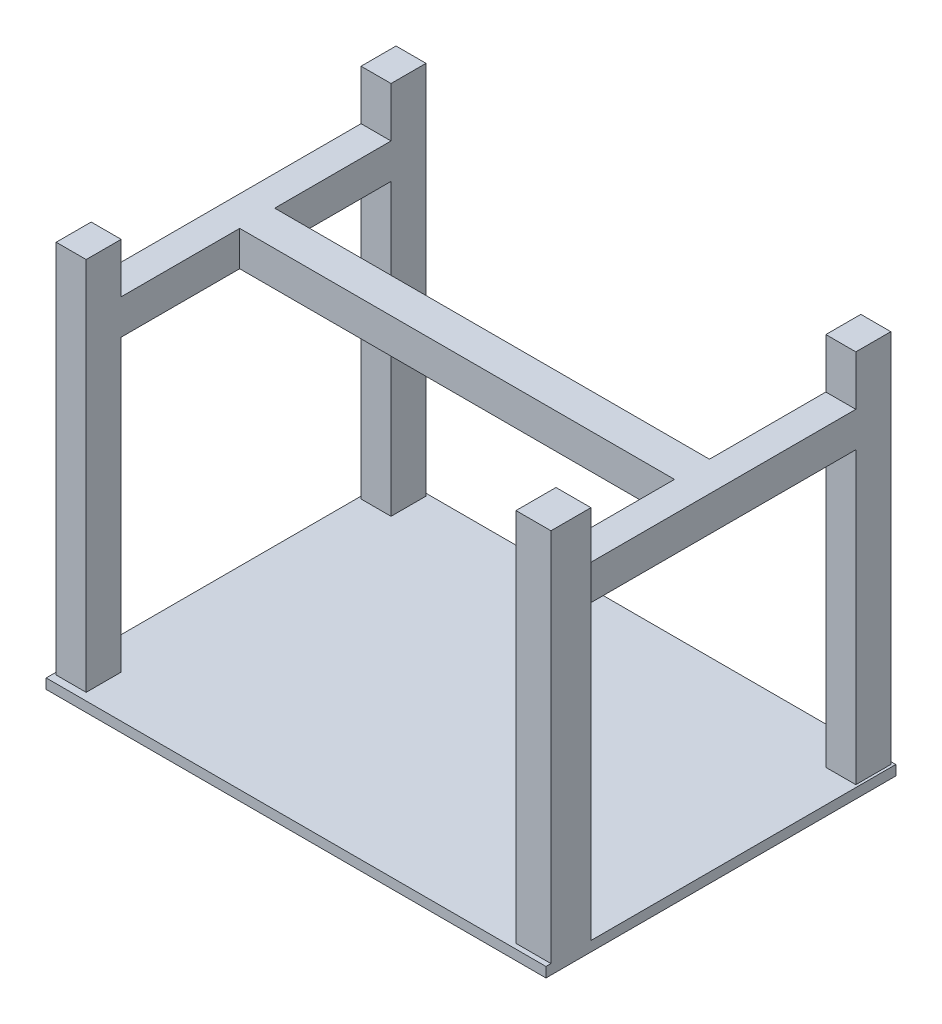
ISO-10303-21;
HEADER;
FILE_DESCRIPTION(('STEP AP214'),'2;1');
FILE_NAME('part.step','',(''),(''),'','','');
FILE_SCHEMA(('AUTOMOTIVE_DESIGN { 1 0 10303 214 1 1 1 1 }'));
ENDSEC;
DATA;
#1=APPLICATION_CONTEXT('core data for automotive mechanical design processes');
#2=APPLICATION_PROTOCOL_DEFINITION('international standard','automotive_design',2000,#1);
#3=PRODUCT_CONTEXT('',#1,'mechanical');
#4=PRODUCT('Part','Part','',(#3));
#5=PRODUCT_RELATED_PRODUCT_CATEGORY('part','',(#4));
#6=PRODUCT_DEFINITION_FORMATION('','',#4);
#7=PRODUCT_DEFINITION_CONTEXT('part definition',#1,'design');
#8=PRODUCT_DEFINITION('design','',#6,#7);
#9=PRODUCT_DEFINITION_SHAPE('','',#8);
#10=(LENGTH_UNIT() NAMED_UNIT(*) SI_UNIT(.MILLI.,.METRE.));
#11=(NAMED_UNIT(*) PLANE_ANGLE_UNIT() SI_UNIT($,.RADIAN.));
#12=(NAMED_UNIT(*) SI_UNIT($,.STERADIAN.) SOLID_ANGLE_UNIT());
#13=UNCERTAINTY_MEASURE_WITH_UNIT(LENGTH_MEASURE(1.E-05),#10,'distance_accuracy_value','');
#14=(GEOMETRIC_REPRESENTATION_CONTEXT(3) GLOBAL_UNCERTAINTY_ASSIGNED_CONTEXT((#13)) GLOBAL_UNIT_ASSIGNED_CONTEXT((#10,
#11,#12)) REPRESENTATION_CONTEXT('',''));
#15=CARTESIAN_POINT('',(0.,0.,0.));
#16=DIRECTION('',(0.,0.,1.));
#17=DIRECTION('',(1.,0.,0.));
#18=AXIS2_PLACEMENT_3D('',#15,#16,#17);
#19=CARTESIAN_POINT('',(869.999999999995,1540.,-690.000000000006));
#20=DIRECTION('',(1.,0.,0.));
#21=DIRECTION('',(0.,0.,-1.));
#22=AXIS2_PLACEMENT_3D('',#19,#20,#21);
#23=PLANE('',#22);
#24=DIRECTION('',(0.,1.,0.));
#25=VECTOR('',#24,1.);
#26=CARTESIAN_POINT('',(870.,1340.83173517957,55.6517130941631));
#27=LINE('',#26,#25);
#28=CARTESIAN_POINT('',(870.,1200.83173517957,55.6517130941631));
#29=VERTEX_POINT('',#28);
#30=CARTESIAN_POINT('',(869.99999999999,1340.83173517957,55.6517130941628));
#31=VERTEX_POINT('',#30);
#32=EDGE_CURVE('E296',#29,#31,#27,.T.);
#33=ORIENTED_EDGE('',*,*,#32,.F.);
#34=DIRECTION('',(0.,0.,1.));
#35=VECTOR('',#34,1.);
#36=CARTESIAN_POINT('',(869.999999999991,1200.83173517957,-734.390889145865));
#37=LINE('',#36,#35);
#38=CARTESIAN_POINT('',(869.999999999991,1200.83173517957,519.999999999994));
#39=VERTEX_POINT('',#38);
#40=EDGE_CURVE('E282',#29,#39,#37,.T.);
#41=ORIENTED_EDGE('',*,*,#40,.T.);
#42=DIRECTION('',(0.,-1.,0.));
#43=VECTOR('',#42,1.);
#44=CARTESIAN_POINT('',(869.999999999989,1540.,519.999999999994));
#45=LINE('',#44,#43);
#46=CARTESIAN_POINT('',(869.99999999999,1340.83173517957,519.999999999993));
#47=VERTEX_POINT('',#46);
#48=EDGE_CURVE('E514',#47,#39,#45,.T.);
#49=ORIENTED_EDGE('',*,*,#48,.F.);
#50=DIRECTION('',(0.,0.,1.));
#51=VECTOR('',#50,1.);
#52=CARTESIAN_POINT('',(869.99999999999,1340.83173517957,-734.390889145865));
#53=LINE('',#52,#51);
#54=EDGE_CURVE('E86',#31,#47,#53,.T.);
#55=ORIENTED_EDGE('',*,*,#54,.F.);
#56=EDGE_LOOP('',(#33,#41,#49,#55));
#57=FACE_BOUND('',#56,.T.);
#58=ADVANCED_FACE('F71',(#57),#23,.F.);
#59=DIRECTION('',(0.,-1.,0.));
#60=VECTOR('',#59,1.);
#61=CARTESIAN_POINT('',(869.999999999999,1340.83173517957,-84.3482869058369));
#62=LINE('',#61,#60);
#63=CARTESIAN_POINT('',(869.99999999999,1340.83173517957,-84.3482869058372));
#64=VERTEX_POINT('',#63);
#65=CARTESIAN_POINT('',(869.999999999991,1200.83173517957,-84.3482869058372));
#66=VERTEX_POINT('',#65);
#67=EDGE_CURVE('E94',#64,#66,#62,.T.);
#68=ORIENTED_EDGE('',*,*,#67,.F.);
#69=CARTESIAN_POINT('',(869.99999999999,1340.83173517957,-550.000000000006));
#70=VERTEX_POINT('',#69);
#71=EDGE_CURVE('E328',#70,#64,#53,.T.);
#72=ORIENTED_EDGE('',*,*,#71,.F.);
#73=DIRECTION('',(0.,-1.,0.));
#74=VECTOR('',#73,1.);
#75=CARTESIAN_POINT('',(869.999999999996,1540.,-550.000000000006));
#76=LINE('',#75,#74);
#77=CARTESIAN_POINT('',(869.999999999996,1540.,-550.000000000006));
#78=VERTEX_POINT('',#77);
#79=EDGE_CURVE('E355',#78,#70,#76,.T.);
#80=ORIENTED_EDGE('',*,*,#79,.F.);
#81=DIRECTION('',(0.,0.,1.));
#82=VECTOR('',#81,1.);
#83=CARTESIAN_POINT('',(869.999999999995,1540.,-690.000000000006));
#84=LINE('',#83,#82);
#85=CARTESIAN_POINT('',(869.999999999995,1540.,-690.000000000006));
#86=VERTEX_POINT('',#85);
#87=EDGE_CURVE('E385',#86,#78,#84,.T.);
#88=ORIENTED_EDGE('',*,*,#87,.F.);
#89=DIRECTION('',(0.,-1.,0.));
#90=VECTOR('',#89,1.);
#91=CARTESIAN_POINT('',(869.999999999995,1540.,-690.000000000006));
#92=LINE('',#91,#90);
#93=CARTESIAN_POINT('',(869.999999999995,40.,-690.000000000006));
#94=VERTEX_POINT('',#93);
#95=EDGE_CURVE('E350',#86,#94,#92,.T.);
#96=ORIENTED_EDGE('',*,*,#95,.T.);
#97=DIRECTION('',(0.,0.,1.));
#98=VECTOR('',#97,1.);
#99=CARTESIAN_POINT('',(869.999999999995,40.,-690.000000000006));
#100=LINE('',#99,#98);
#101=CARTESIAN_POINT('',(869.999999999996,40.,-550.000000000006));
#102=VERTEX_POINT('',#101);
#103=EDGE_CURVE('E373',#94,#102,#100,.T.);
#104=ORIENTED_EDGE('',*,*,#103,.T.);
#105=CARTESIAN_POINT('',(869.999999999991,1200.83173517957,-550.000000000006));
#106=VERTEX_POINT('',#105);
#107=EDGE_CURVE('E353',#106,#102,#76,.T.);
#108=ORIENTED_EDGE('',*,*,#107,.F.);
#109=EDGE_CURVE('E292',#106,#66,#37,.T.);
#110=ORIENTED_EDGE('',*,*,#109,.T.);
#111=EDGE_LOOP('',(#68,#72,#80,#88,#96,#104,#108,#110));
#112=FACE_BOUND('',#111,.T.);
#113=ADVANCED_FACE('F547',(#112),#23,.F.);
#114=CARTESIAN_POINT('',(-870.,1540.,-690.));
#115=DIRECTION('',(1.,0.,0.));
#116=DIRECTION('',(0.,0.,-1.));
#117=AXIS2_PLACEMENT_3D('',#114,#115,#116);
#118=PLANE('',#117);
#119=DIRECTION('',(0.,0.,1.));
#120=VECTOR('',#119,1.);
#121=CARTESIAN_POINT('',(-870.,1200.83173517957,-734.390889145865));
#122=LINE('',#121,#120);
#123=CARTESIAN_POINT('',(-870.,1200.83173517957,55.6517130941752));
#124=VERTEX_POINT('',#123);
#125=CARTESIAN_POINT('',(-870.,1200.83173517957,530.));
#126=VERTEX_POINT('',#125);
#127=EDGE_CURVE('E324',#124,#126,#122,.T.);
#128=ORIENTED_EDGE('',*,*,#127,.F.);
#129=DIRECTION('',(0.,-1.,0.));
#130=VECTOR('',#129,1.);
#131=CARTESIAN_POINT('',(-870.,1340.83173517957,55.6517130941741));
#132=LINE('',#131,#130);
#133=CARTESIAN_POINT('',(-870.,1340.83173517957,55.6517130941741));
#134=VERTEX_POINT('',#133);
#135=EDGE_CURVE('E302',#134,#124,#132,.T.);
#136=ORIENTED_EDGE('',*,*,#135,.F.);
#137=DIRECTION('',(0.,0.,1.));
#138=VECTOR('',#137,1.);
#139=CARTESIAN_POINT('',(-870.,1340.83173517957,-734.390889145865));
#140=LINE('',#139,#138);
#141=CARTESIAN_POINT('',(-870.,1340.83173517957,530.));
#142=VERTEX_POINT('',#141);
#143=EDGE_CURVE('E321',#134,#142,#140,.T.);
#144=ORIENTED_EDGE('',*,*,#143,.T.);
#145=DIRECTION('',(0.,-1.,0.));
#146=VECTOR('',#145,1.);
#147=CARTESIAN_POINT('',(-870.,1540.,530.));
#148=LINE('',#147,#146);
#149=CARTESIAN_POINT('',(-870.,1540.,530.));
#150=VERTEX_POINT('',#149);
#151=EDGE_CURVE('E477',#150,#142,#148,.T.);
#152=ORIENTED_EDGE('',*,*,#151,.F.);
#153=DIRECTION('',(0.,0.,-1.));
#154=VECTOR('',#153,1.);
#155=CARTESIAN_POINT('',(-870.,1540.,0.));
#156=LINE('',#155,#154);
#157=CARTESIAN_POINT('',(-870.,1540.,670.));
#158=VERTEX_POINT('',#157);
#159=EDGE_CURVE('E457',#158,#150,#156,.T.);
#160=ORIENTED_EDGE('',*,*,#159,.F.);
#161=DIRECTION('',(0.,-1.,0.));
#162=VECTOR('',#161,1.);
#163=CARTESIAN_POINT('',(-870.,1540.,670.));
#164=LINE('',#163,#162);
#165=CARTESIAN_POINT('',(-870.,40.,670.));
#166=VERTEX_POINT('',#165);
#167=EDGE_CURVE('E480',#158,#166,#164,.T.);
#168=ORIENTED_EDGE('',*,*,#167,.T.);
#169=DIRECTION('',(0.,0.,-1.));
#170=VECTOR('',#169,1.);
#171=CARTESIAN_POINT('',(-870.,40.,0.));
#172=LINE('',#171,#170);
#173=CARTESIAN_POINT('',(-870.,40.,530.));
#174=VERTEX_POINT('',#173);
#175=EDGE_CURVE('E468',#166,#174,#172,.T.);
#176=ORIENTED_EDGE('',*,*,#175,.T.);
#177=EDGE_CURVE('E476',#126,#174,#148,.T.);
#178=ORIENTED_EDGE('',*,*,#177,.F.);
#179=EDGE_LOOP('',(#128,#136,#144,#152,#160,#168,#176,#178));
#180=FACE_BOUND('',#179,.T.);
#181=ADVANCED_FACE('F574',(#180),#118,.T.);
#182=CARTESIAN_POINT('',(-870.,1340.83173517957,-549.999999999993));
#183=VERTEX_POINT('',#182);
#184=CARTESIAN_POINT('',(-870.,1340.83173517957,-84.3482869058369));
#185=VERTEX_POINT('',#184);
#186=EDGE_CURVE('E318',#183,#185,#140,.T.);
#187=ORIENTED_EDGE('',*,*,#186,.T.);
#188=DIRECTION('',(0.,1.,0.));
#189=VECTOR('',#188,1.);
#190=CARTESIAN_POINT('',(-870.,1340.83173517957,-84.3482869058259));
#191=LINE('',#190,#189);
#192=CARTESIAN_POINT('',(-870.,1200.83173517957,-84.3482869058369));
#193=VERTEX_POINT('',#192);
#194=EDGE_CURVE('E341',#193,#185,#191,.T.);
#195=ORIENTED_EDGE('',*,*,#194,.F.);
#196=CARTESIAN_POINT('',(-870.,1200.83173517957,-550.));
#197=VERTEX_POINT('',#196);
#198=EDGE_CURVE('E322',#197,#193,#122,.T.);
#199=ORIENTED_EDGE('',*,*,#198,.F.);
#200=DIRECTION('',(0.,-1.,0.));
#201=VECTOR('',#200,1.);
#202=CARTESIAN_POINT('',(-870.,1540.,-550.));
#203=LINE('',#202,#201);
#204=CARTESIAN_POINT('',(-870.,40.,-550.));
#205=VERTEX_POINT('',#204);
#206=EDGE_CURVE('E425',#197,#205,#203,.T.);
#207=ORIENTED_EDGE('',*,*,#206,.T.);
#208=DIRECTION('',(0.,0.,1.));
#209=VECTOR('',#208,1.);
#210=CARTESIAN_POINT('',(-870.,40.,-690.));
#211=LINE('',#210,#209);
#212=CARTESIAN_POINT('',(-870.,40.,-690.));
#213=VERTEX_POINT('',#212);
#214=EDGE_CURVE('E439',#213,#205,#211,.T.);
#215=ORIENTED_EDGE('',*,*,#214,.F.);
#216=DIRECTION('',(0.,-1.,0.));
#217=VECTOR('',#216,1.);
#218=CARTESIAN_POINT('',(-870.,1540.,-690.));
#219=LINE('',#218,#217);
#220=CARTESIAN_POINT('',(-870.,1540.,-690.));
#221=VERTEX_POINT('',#220);
#222=EDGE_CURVE('E418',#221,#213,#219,.T.);
#223=ORIENTED_EDGE('',*,*,#222,.F.);
#224=DIRECTION('',(0.,0.,1.));
#225=VECTOR('',#224,1.);
#226=CARTESIAN_POINT('',(-870.,1540.,-690.));
#227=LINE('',#226,#225);
#228=CARTESIAN_POINT('',(-870.,1540.,-550.));
#229=VERTEX_POINT('',#228);
#230=EDGE_CURVE('E446',#221,#229,#227,.T.);
#231=ORIENTED_EDGE('',*,*,#230,.T.);
#232=EDGE_CURVE('E422',#229,#183,#203,.T.);
#233=ORIENTED_EDGE('',*,*,#232,.T.);
#234=EDGE_LOOP('',(#187,#195,#199,#207,#215,#223,#231,#233));
#235=FACE_BOUND('',#234,.T.);
#236=ADVANCED_FACE('F556',(#235),#118,.T.);
#237=CARTESIAN_POINT('',(0.,1540.,530.));
#238=DIRECTION('',(0.,0.,-1.));
#239=DIRECTION('',(-1.,0.,0.));
#240=AXIS2_PLACEMENT_3D('',#237,#238,#239);
#241=PLANE('',#240);
#242=DIRECTION('',(1.,0.,0.));
#243=VECTOR('',#242,1.);
#244=CARTESIAN_POINT('',(0.,1340.83173517957,530.));
#245=LINE('',#244,#243);
#246=CARTESIAN_POINT('',(-990.,1340.83173517957,530.));
#247=VERTEX_POINT('',#246);
#248=EDGE_CURVE('E346',#247,#142,#245,.T.);
#249=ORIENTED_EDGE('',*,*,#248,.F.);
#250=DIRECTION('',(0.,-1.,0.));
#251=VECTOR('',#250,1.);
#252=CARTESIAN_POINT('',(-990.,1540.,530.));
#253=LINE('',#252,#251);
#254=CARTESIAN_POINT('',(-990.,1540.,530.));
#255=VERTEX_POINT('',#254);
#256=EDGE_CURVE('E473',#255,#247,#253,.T.);
#257=ORIENTED_EDGE('',*,*,#256,.F.);
#258=DIRECTION('',(1.,0.,0.));
#259=VECTOR('',#258,1.);
#260=CARTESIAN_POINT('',(0.,1540.,530.));
#261=LINE('',#260,#259);
#262=EDGE_CURVE('E459',#255,#150,#261,.T.);
#263=ORIENTED_EDGE('',*,*,#262,.T.);
#264=ORIENTED_EDGE('',*,*,#151,.T.);
#265=EDGE_LOOP('',(#249,#257,#263,#264));
#266=FACE_BOUND('',#265,.T.);
#267=ADVANCED_FACE('F570',(#266),#241,.T.);
#268=CARTESIAN_POINT('',(989.999999999996,1540.,-550.000000000007));
#269=DIRECTION('',(0.,0.,1.));
#270=DIRECTION('',(1.,0.,0.));
#271=AXIS2_PLACEMENT_3D('',#268,#269,#270);
#272=PLANE('',#271);
#273=DIRECTION('',(1.,0.,0.));
#274=VECTOR('',#273,1.);
#275=CARTESIAN_POINT('',(989.999999999992,1340.83173517957,-550.000000000007));
#276=LINE('',#275,#274);
#277=CARTESIAN_POINT('',(989.99999999999,1340.83173517957,-550.000000000007));
#278=VERTEX_POINT('',#277);
#279=EDGE_CURVE('E338',#70,#278,#276,.T.);
#280=ORIENTED_EDGE('',*,*,#279,.T.);
#281=DIRECTION('',(0.,-1.,0.));
#282=VECTOR('',#281,1.);
#283=CARTESIAN_POINT('',(989.999999999996,1540.,-550.000000000007));
#284=LINE('',#283,#282);
#285=CARTESIAN_POINT('',(989.999999999996,1540.,-550.000000000007));
#286=VERTEX_POINT('',#285);
#287=EDGE_CURVE('E359',#286,#278,#284,.T.);
#288=ORIENTED_EDGE('',*,*,#287,.F.);
#289=DIRECTION('',(-1.,0.,0.));
#290=VECTOR('',#289,1.);
#291=CARTESIAN_POINT('',(989.999999999996,1540.,-550.000000000007));
#292=LINE('',#291,#290);
#293=EDGE_CURVE('E382',#286,#78,#292,.T.);
#294=ORIENTED_EDGE('',*,*,#293,.T.);
#295=ORIENTED_EDGE('',*,*,#79,.T.);
#296=EDGE_LOOP('',(#280,#288,#294,#295));
#297=FACE_BOUND('',#296,.T.);
#298=ADVANCED_FACE('F542',(#297),#272,.T.);
#299=CARTESIAN_POINT('',(-990.,1540.,-550.));
#300=DIRECTION('',(0.,0.,-1.));
#301=DIRECTION('',(-1.,0.,0.));
#302=AXIS2_PLACEMENT_3D('',#299,#300,#301);
#303=PLANE('',#302);
#304=DIRECTION('',(0.,-1.,0.));
#305=VECTOR('',#304,1.);
#306=CARTESIAN_POINT('',(-990.,1540.,-550.));
#307=LINE('',#306,#305);
#308=CARTESIAN_POINT('',(-990.,1540.,-550.));
#309=VERTEX_POINT('',#308);
#310=CARTESIAN_POINT('',(-990.,1340.83173517957,-549.999999999992));
#311=VERTEX_POINT('',#310);
#312=EDGE_CURVE('E426',#309,#311,#307,.T.);
#313=ORIENTED_EDGE('',*,*,#312,.T.);
#314=DIRECTION('',(1.,0.,0.));
#315=VECTOR('',#314,1.);
#316=CARTESIAN_POINT('',(-989.999999999998,1340.83173517957,-549.999999999992));
#317=LINE('',#316,#315);
#318=EDGE_CURVE('E311',#311,#183,#317,.T.);
#319=ORIENTED_EDGE('',*,*,#318,.T.);
#320=ORIENTED_EDGE('',*,*,#232,.F.);
#321=DIRECTION('',(1.,0.,0.));
#322=VECTOR('',#321,1.);
#323=CARTESIAN_POINT('',(-990.,1540.,-550.));
#324=LINE('',#323,#322);
#325=EDGE_CURVE('E444',#309,#229,#324,.T.);
#326=ORIENTED_EDGE('',*,*,#325,.F.);
#327=EDGE_LOOP('',(#313,#319,#320,#326));
#328=FACE_BOUND('',#327,.T.);
#329=ADVANCED_FACE('F561',(#328),#303,.F.);
#330=CARTESIAN_POINT('',(0.,40.,0.));
#331=DIRECTION('',(0.,1.,0.));
#332=DIRECTION('',(0.,0.,1.));
#333=AXIS2_PLACEMENT_3D('',#330,#331,#332);
#334=PLANE('',#333);
#335=DIRECTION('',(1.,0.,0.));
#336=VECTOR('',#335,1.);
#337=CARTESIAN_POINT('',(-990.,40.,-690.));
#338=LINE('',#337,#336);
#339=CARTESIAN_POINT('',(-990.,40.,-690.));
#340=VERTEX_POINT('',#339);
#341=EDGE_CURVE('E402',#340,#213,#338,.T.);
#342=ORIENTED_EDGE('',*,*,#341,.T.);
#343=ORIENTED_EDGE('',*,*,#214,.T.);
#344=DIRECTION('',(1.,0.,0.));
#345=VECTOR('',#344,1.);
#346=CARTESIAN_POINT('',(-990.,40.,-550.));
#347=LINE('',#346,#345);
#348=CARTESIAN_POINT('',(-990.,40.,-550.));
#349=VERTEX_POINT('',#348);
#350=EDGE_CURVE('E435',#349,#205,#347,.T.);
#351=ORIENTED_EDGE('',*,*,#350,.F.);
#352=DIRECTION('',(0.,0.,1.));
#353=VECTOR('',#352,1.);
#354=CARTESIAN_POINT('',(-990.,40.,-690.));
#355=LINE('',#354,#353);
#356=EDGE_CURVE('E432',#340,#349,#355,.T.);
#357=ORIENTED_EDGE('',*,*,#356,.F.);
#358=EDGE_LOOP('',(#342,#343,#351,#357));
#359=FACE_BOUND('',#358,.T.);
#360=ORIENTED_EDGE('',*,*,#175,.F.);
#361=DIRECTION('',(1.,0.,0.));
#362=VECTOR('',#361,1.);
#363=CARTESIAN_POINT('',(0.,40.,670.));
#364=LINE('',#363,#362);
#365=CARTESIAN_POINT('',(-990.,40.,670.));
#366=VERTEX_POINT('',#365);
#367=EDGE_CURVE('E465',#366,#166,#364,.T.);
#368=ORIENTED_EDGE('',*,*,#367,.F.);
#369=DIRECTION('',(0.,0.,-1.));
#370=VECTOR('',#369,1.);
#371=CARTESIAN_POINT('',(-990.,40.,0.));
#372=LINE('',#371,#370);
#373=CARTESIAN_POINT('',(-990.,40.,530.));
#374=VERTEX_POINT('',#373);
#375=EDGE_CURVE('E379',#366,#374,#372,.T.);
#376=ORIENTED_EDGE('',*,*,#375,.T.);
#377=DIRECTION('',(1.,0.,0.));
#378=VECTOR('',#377,1.);
#379=CARTESIAN_POINT('',(0.,40.,530.));
#380=LINE('',#379,#378);
#381=EDGE_CURVE('E455',#374,#174,#380,.T.);
#382=ORIENTED_EDGE('',*,*,#381,.T.);
#383=EDGE_LOOP('',(#360,#368,#376,#382));
#384=FACE_BOUND('',#383,.T.);
#385=ORIENTED_EDGE('',*,*,#103,.F.);
#386=DIRECTION('',(-1.,0.,0.));
#387=VECTOR('',#386,1.);
#388=CARTESIAN_POINT('',(989.999999999995,40.,-690.000000000007));
#389=LINE('',#388,#387);
#390=CARTESIAN_POINT('',(989.999999999995,40.,-690.000000000007));
#391=VERTEX_POINT('',#390);
#392=EDGE_CURVE('E376',#391,#94,#389,.T.);
#393=ORIENTED_EDGE('',*,*,#392,.F.);
#394=DIRECTION('',(0.,0.,1.));
#395=VECTOR('',#394,1.);
#396=CARTESIAN_POINT('',(989.999999999995,40.,-690.000000000007));
#397=LINE('',#396,#395);
#398=CARTESIAN_POINT('',(989.999999999996,40.,-550.000000000007));
#399=VERTEX_POINT('',#398);
#400=EDGE_CURVE('E366',#391,#399,#397,.T.);
#401=ORIENTED_EDGE('',*,*,#400,.T.);
#402=DIRECTION('',(-1.,0.,0.));
#403=VECTOR('',#402,1.);
#404=CARTESIAN_POINT('',(989.999999999996,40.,-550.000000000007));
#405=LINE('',#404,#403);
#406=EDGE_CURVE('E369',#399,#102,#405,.T.);
#407=ORIENTED_EDGE('',*,*,#406,.T.);
#408=EDGE_LOOP('',(#385,#393,#401,#407));
#409=FACE_BOUND('',#408,.T.);
#410=DIRECTION('',(0.,0.,-1.));
#411=VECTOR('',#410,1.);
#412=CARTESIAN_POINT('',(1000.,40.,-700.));
#413=LINE('',#412,#411);
#414=CARTESIAN_POINT('',(1000.,40.,700.));
#415=VERTEX_POINT('',#414);
#416=CARTESIAN_POINT('',(1000.,40.,679.999999999994));
#417=VERTEX_POINT('',#416);
#418=EDGE_CURVE('E485',#415,#417,#413,.T.);
#419=ORIENTED_EDGE('',*,*,#418,.T.);
#420=DIRECTION('',(-1.,0.,0.));
#421=VECTOR('',#420,1.);
#422=CARTESIAN_POINT('',(1000.,40.,679.999999999993));
#423=LINE('',#422,#421);
#424=CARTESIAN_POINT('',(860.000000000004,40.,679.999999999994));
#425=VERTEX_POINT('',#424);
#426=EDGE_CURVE('E354',#417,#425,#423,.T.);
#427=ORIENTED_EDGE('',*,*,#426,.T.);
#428=DIRECTION('',(0.,0.,-1.));
#429=VECTOR('',#428,1.);
#430=CARTESIAN_POINT('',(860.000000000004,40.,679.999999999994));
#431=LINE('',#430,#429);
#432=CARTESIAN_POINT('',(860.000000000003,40.,519.999999999994));
#433=VERTEX_POINT('',#432);
#434=EDGE_CURVE('E406',#425,#433,#431,.T.);
#435=ORIENTED_EDGE('',*,*,#434,.T.);
#436=DIRECTION('',(-1.,0.,0.));
#437=VECTOR('',#436,1.);
#438=CARTESIAN_POINT('',(1000.,40.,519.999999999993));
#439=LINE('',#438,#437);
#440=CARTESIAN_POINT('',(1000.,40.,519.999999999994));
#441=VERTEX_POINT('',#440);
#442=EDGE_CURVE('E403',#441,#433,#439,.T.);
#443=ORIENTED_EDGE('',*,*,#442,.F.);
#444=CARTESIAN_POINT('',(1000.,40.,-700.));
#445=VERTEX_POINT('',#444);
#446=EDGE_CURVE('E488',#441,#445,#413,.T.);
#447=ORIENTED_EDGE('',*,*,#446,.T.);
#448=DIRECTION('',(-1.,0.,0.));
#449=VECTOR('',#448,1.);
#450=CARTESIAN_POINT('',(-1000.,40.,-700.));
#451=LINE('',#450,#449);
#452=CARTESIAN_POINT('',(-1000.,40.,-700.));
#453=VERTEX_POINT('',#452);
#454=EDGE_CURVE('E487',#445,#453,#451,.T.);
#455=ORIENTED_EDGE('',*,*,#454,.T.);
#456=DIRECTION('',(0.,0.,1.));
#457=VECTOR('',#456,1.);
#458=CARTESIAN_POINT('',(-1000.,40.,-700.));
#459=LINE('',#458,#457);
#460=CARTESIAN_POINT('',(-1000.,40.,700.));
#461=VERTEX_POINT('',#460);
#462=EDGE_CURVE('E490',#453,#461,#459,.T.);
#463=ORIENTED_EDGE('',*,*,#462,.T.);
#464=DIRECTION('',(1.,0.,0.));
#465=VECTOR('',#464,1.);
#466=CARTESIAN_POINT('',(-1000.,40.,700.));
#467=LINE('',#466,#465);
#468=EDGE_CURVE('E492',#461,#415,#467,.T.);
#469=ORIENTED_EDGE('',*,*,#468,.T.);
#470=EDGE_LOOP('',(#419,#427,#435,#443,#447,#455,#463,#469));
#471=FACE_BOUND('',#470,.T.);
#472=ADVANCED_FACE('F530',(#359,#384,#409,#471),#334,.T.);
#473=CARTESIAN_POINT('',(1000.,40.,-700.));
#474=DIRECTION('',(-1.,0.,0.));
#475=DIRECTION('',(0.,0.,1.));
#476=AXIS2_PLACEMENT_3D('',#473,#474,#475);
#477=PLANE('',#476);
#478=DIRECTION('',(0.,0.,-1.));
#479=VECTOR('',#478,1.);
#480=CARTESIAN_POINT('',(1000.,0.,-700.));
#481=LINE('',#480,#479);
#482=CARTESIAN_POINT('',(1000.,0.,700.));
#483=VERTEX_POINT('',#482);
#484=CARTESIAN_POINT('',(1000.,0.,-700.));
#485=VERTEX_POINT('',#484);
#486=EDGE_CURVE('E484',#483,#485,#481,.T.);
#487=ORIENTED_EDGE('',*,*,#486,.T.);
#488=DIRECTION('',(0.,-1.,0.));
#489=VECTOR('',#488,1.);
#490=CARTESIAN_POINT('',(1000.,40.,-700.));
#491=LINE('',#490,#489);
#492=EDGE_CURVE('E511',#445,#485,#491,.T.);
#493=ORIENTED_EDGE('',*,*,#492,.F.);
#494=ORIENTED_EDGE('',*,*,#446,.F.);
#495=DIRECTION('',(0.,-1.,0.));
#496=VECTOR('',#495,1.);
#497=CARTESIAN_POINT('',(1000.,1540.,519.999999999993));
#498=LINE('',#497,#496);
#499=CARTESIAN_POINT('',(1000.,1540.,519.999999999993));
#500=VERTEX_POINT('',#499);
#501=EDGE_CURVE('E396',#500,#441,#498,.T.);
#502=ORIENTED_EDGE('',*,*,#501,.F.);
#503=DIRECTION('',(0.,0.,-1.));
#504=VECTOR('',#503,1.);
#505=CARTESIAN_POINT('',(1000.,1540.,679.999999999993));
#506=LINE('',#505,#504);
#507=CARTESIAN_POINT('',(1000.,1540.,679.999999999993));
#508=VERTEX_POINT('',#507);
#509=EDGE_CURVE('E392',#508,#500,#506,.T.);
#510=ORIENTED_EDGE('',*,*,#509,.F.);
#511=DIRECTION('',(0.,-1.,0.));
#512=VECTOR('',#511,1.);
#513=CARTESIAN_POINT('',(1000.,1540.,679.999999999993));
#514=LINE('',#513,#512);
#515=EDGE_CURVE('E399',#508,#417,#514,.T.);
#516=ORIENTED_EDGE('',*,*,#515,.T.);
#517=ORIENTED_EDGE('',*,*,#418,.F.);
#518=DIRECTION('',(0.,-1.,0.));
#519=VECTOR('',#518,1.);
#520=CARTESIAN_POINT('',(1000.,40.,700.));
#521=LINE('',#520,#519);
#522=EDGE_CURVE('E494',#415,#483,#521,.T.);
#523=ORIENTED_EDGE('',*,*,#522,.T.);
#524=EDGE_LOOP('',(#487,#493,#494,#502,#510,#516,#517,#523));
#525=FACE_BOUND('',#524,.T.);
#526=ADVANCED_FACE('F73',(#525),#477,.F.);
#527=CARTESIAN_POINT('',(-1000.,40.,-700.));
#528=DIRECTION('',(0.,0.,1.));
#529=DIRECTION('',(1.,0.,0.));
#530=AXIS2_PLACEMENT_3D('',#527,#528,#529);
#531=PLANE('',#530);
#532=DIRECTION('',(-1.,0.,0.));
#533=VECTOR('',#532,1.);
#534=CARTESIAN_POINT('',(-1000.,0.,-700.));
#535=LINE('',#534,#533);
#536=CARTESIAN_POINT('',(-1000.,0.,-700.));
#537=VERTEX_POINT('',#536);
#538=EDGE_CURVE('E497',#485,#537,#535,.T.);
#539=ORIENTED_EDGE('',*,*,#538,.T.);
#540=DIRECTION('',(0.,-1.,0.));
#541=VECTOR('',#540,1.);
#542=CARTESIAN_POINT('',(-1000.,40.,-700.));
#543=LINE('',#542,#541);
#544=EDGE_CURVE('E508',#453,#537,#543,.T.);
#545=ORIENTED_EDGE('',*,*,#544,.F.);
#546=ORIENTED_EDGE('',*,*,#454,.F.);
#547=ORIENTED_EDGE('',*,*,#492,.T.);
#548=EDGE_LOOP('',(#539,#545,#546,#547));
#549=FACE_BOUND('',#548,.T.);
#550=ADVANCED_FACE('F655',(#549),#531,.F.);
#551=CARTESIAN_POINT('',(-1000.,40.,-700.));
#552=DIRECTION('',(1.,0.,0.));
#553=DIRECTION('',(0.,0.,-1.));
#554=AXIS2_PLACEMENT_3D('',#551,#552,#553);
#555=PLANE('',#554);
#556=DIRECTION('',(0.,0.,1.));
#557=VECTOR('',#556,1.);
#558=CARTESIAN_POINT('',(-1000.,0.,-700.));
#559=LINE('',#558,#557);
#560=CARTESIAN_POINT('',(-1000.,0.,700.));
#561=VERTEX_POINT('',#560);
#562=EDGE_CURVE('E499',#537,#561,#559,.T.);
#563=ORIENTED_EDGE('',*,*,#562,.T.);
#564=DIRECTION('',(0.,-1.,0.));
#565=VECTOR('',#564,1.);
#566=CARTESIAN_POINT('',(-1000.,40.,700.));
#567=LINE('',#566,#565);
#568=EDGE_CURVE('E505',#461,#561,#567,.T.);
#569=ORIENTED_EDGE('',*,*,#568,.F.);
#570=ORIENTED_EDGE('',*,*,#462,.F.);
#571=ORIENTED_EDGE('',*,*,#544,.T.);
#572=EDGE_LOOP('',(#563,#569,#570,#571));
#573=FACE_BOUND('',#572,.T.);
#574=ADVANCED_FACE('F667',(#573),#555,.F.);
#575=CARTESIAN_POINT('',(-1000.,40.,700.));
#576=DIRECTION('',(0.,0.,-1.));
#577=DIRECTION('',(-1.,0.,0.));
#578=AXIS2_PLACEMENT_3D('',#575,#576,#577);
#579=PLANE('',#578);
#580=DIRECTION('',(1.,0.,0.));
#581=VECTOR('',#580,1.);
#582=CARTESIAN_POINT('',(-1000.,0.,700.));
#583=LINE('',#582,#581);
#584=EDGE_CURVE('E501',#561,#483,#583,.T.);
#585=ORIENTED_EDGE('',*,*,#584,.T.);
#586=ORIENTED_EDGE('',*,*,#522,.F.);
#587=ORIENTED_EDGE('',*,*,#468,.F.);
#588=ORIENTED_EDGE('',*,*,#568,.T.);
#589=EDGE_LOOP('',(#585,#586,#587,#588));
#590=FACE_BOUND('',#589,.T.);
#591=ADVANCED_FACE('F663',(#590),#579,.F.);
#592=CARTESIAN_POINT('',(0.,0.,0.));
#593=DIRECTION('',(0.,1.,0.));
#594=DIRECTION('',(0.,0.,1.));
#595=AXIS2_PLACEMENT_3D('',#592,#593,#594);
#596=PLANE('',#595);
#597=ORIENTED_EDGE('',*,*,#486,.F.);
#598=ORIENTED_EDGE('',*,*,#584,.F.);
#599=ORIENTED_EDGE('',*,*,#562,.F.);
#600=ORIENTED_EDGE('',*,*,#538,.F.);
#601=EDGE_LOOP('',(#597,#598,#599,#600));
#602=FACE_BOUND('',#601,.T.);
#603=ADVANCED_FACE('F660',(#602),#596,.F.);
#604=CARTESIAN_POINT('',(0.,1540.,670.));
#605=DIRECTION('',(0.,0.,-1.));
#606=DIRECTION('',(-1.,0.,0.));
#607=AXIS2_PLACEMENT_3D('',#604,#605,#606);
#608=PLANE('',#607);
#609=ORIENTED_EDGE('',*,*,#367,.T.);
#610=ORIENTED_EDGE('',*,*,#167,.F.);
#611=DIRECTION('',(1.,0.,0.));
#612=VECTOR('',#611,1.);
#613=CARTESIAN_POINT('',(0.,1540.,670.));
#614=LINE('',#613,#612);
#615=CARTESIAN_POINT('',(-990.,1540.,670.));
#616=VERTEX_POINT('',#615);
#617=EDGE_CURVE('E454',#616,#158,#614,.T.);
#618=ORIENTED_EDGE('',*,*,#617,.F.);
#619=DIRECTION('',(0.,-1.,0.));
#620=VECTOR('',#619,1.);
#621=CARTESIAN_POINT('',(-990.,1540.,670.));
#622=LINE('',#621,#620);
#623=EDGE_CURVE('E482',#616,#366,#622,.T.);
#624=ORIENTED_EDGE('',*,*,#623,.T.);
#625=EDGE_LOOP('',(#609,#610,#618,#624));
#626=FACE_BOUND('',#625,.T.);
#627=ADVANCED_FACE('F588',(#626),#608,.F.);
#628=DIRECTION('',(-1.,0.,0.));
#629=VECTOR('',#628,1.);
#630=CARTESIAN_POINT('',(0.,1200.83173517957,530.));
#631=LINE('',#630,#629);
#632=CARTESIAN_POINT('',(-990.,1200.83173517957,529.999999999999));
#633=VERTEX_POINT('',#632);
#634=EDGE_CURVE('E331',#126,#633,#631,.T.);
#635=ORIENTED_EDGE('',*,*,#634,.F.);
#636=ORIENTED_EDGE('',*,*,#177,.T.);
#637=ORIENTED_EDGE('',*,*,#381,.F.);
#638=EDGE_CURVE('E462',#633,#374,#253,.T.);
#639=ORIENTED_EDGE('',*,*,#638,.F.);
#640=EDGE_LOOP('',(#635,#636,#637,#639));
#641=FACE_BOUND('',#640,.T.);
#642=ADVANCED_FACE('F579',(#641),#241,.T.);
#643=CARTESIAN_POINT('',(0.,1540.,0.));
#644=DIRECTION('',(0.,1.,0.));
#645=DIRECTION('',(0.,0.,1.));
#646=AXIS2_PLACEMENT_3D('',#643,#644,#645);
#647=PLANE('',#646);
#648=DIRECTION('',(0.,0.,-1.));
#649=VECTOR('',#648,1.);
#650=CARTESIAN_POINT('',(-990.,1540.,0.));
#651=LINE('',#650,#649);
#652=EDGE_CURVE('E451',#616,#255,#651,.T.);
#653=ORIENTED_EDGE('',*,*,#652,.F.);
#654=ORIENTED_EDGE('',*,*,#617,.T.);
#655=ORIENTED_EDGE('',*,*,#159,.T.);
#656=ORIENTED_EDGE('',*,*,#262,.F.);
#657=EDGE_LOOP('',(#653,#654,#655,#656));
#658=FACE_BOUND('',#657,.T.);
#659=ADVANCED_FACE('F591',(#658),#647,.T.);
#660=CARTESIAN_POINT('',(989.999999999995,1540.,-690.000000000007));
#661=DIRECTION('',(0.,0.,1.));
#662=DIRECTION('',(1.,0.,0.));
#663=AXIS2_PLACEMENT_3D('',#660,#661,#662);
#664=PLANE('',#663);
#665=ORIENTED_EDGE('',*,*,#392,.T.);
#666=ORIENTED_EDGE('',*,*,#95,.F.);
#667=DIRECTION('',(-1.,0.,0.));
#668=VECTOR('',#667,1.);
#669=CARTESIAN_POINT('',(989.999999999995,1540.,-690.000000000007));
#670=LINE('',#669,#668);
#671=CARTESIAN_POINT('',(989.999999999995,1540.,-690.000000000007));
#672=VERTEX_POINT('',#671);
#673=EDGE_CURVE('E370',#672,#86,#670,.T.);
#674=ORIENTED_EDGE('',*,*,#673,.F.);
#675=DIRECTION('',(0.,-1.,0.));
#676=VECTOR('',#675,1.);
#677=CARTESIAN_POINT('',(989.999999999995,1540.,-690.000000000007));
#678=LINE('',#677,#676);
#679=EDGE_CURVE('E362',#672,#391,#678,.T.);
#680=ORIENTED_EDGE('',*,*,#679,.T.);
#681=EDGE_LOOP('',(#665,#666,#674,#680));
#682=FACE_BOUND('',#681,.T.);
#683=ADVANCED_FACE('F535',(#682),#664,.F.);
#684=DIRECTION('',(-1.,0.,0.));
#685=VECTOR('',#684,1.);
#686=CARTESIAN_POINT('',(989.999999999992,1200.83173517957,-550.000000000007));
#687=LINE('',#686,#685);
#688=CARTESIAN_POINT('',(989.999999999996,1200.83173517957,-550.000000000007));
#689=VERTEX_POINT('',#688);
#690=EDGE_CURVE('E337',#689,#106,#687,.T.);
#691=ORIENTED_EDGE('',*,*,#690,.T.);
#692=ORIENTED_EDGE('',*,*,#107,.T.);
#693=ORIENTED_EDGE('',*,*,#406,.F.);
#694=EDGE_CURVE('E358',#689,#399,#284,.T.);
#695=ORIENTED_EDGE('',*,*,#694,.F.);
#696=EDGE_LOOP('',(#691,#692,#693,#695));
#697=FACE_BOUND('',#696,.T.);
#698=ADVANCED_FACE('F528',(#697),#272,.T.);
#699=CARTESIAN_POINT('',(989.999999999995,1540.,-690.000000000007));
#700=DIRECTION('',(1.,0.,0.));
#701=DIRECTION('',(0.,0.,-1.));
#702=AXIS2_PLACEMENT_3D('',#699,#700,#701);
#703=PLANE('',#702);
#704=ORIENTED_EDGE('',*,*,#400,.F.);
#705=ORIENTED_EDGE('',*,*,#679,.F.);
#706=DIRECTION('',(0.,0.,1.));
#707=VECTOR('',#706,1.);
#708=CARTESIAN_POINT('',(989.999999999995,1540.,-690.000000000007));
#709=LINE('',#708,#707);
#710=EDGE_CURVE('E365',#672,#286,#709,.T.);
#711=ORIENTED_EDGE('',*,*,#710,.T.);
#712=ORIENTED_EDGE('',*,*,#287,.T.);
#713=DIRECTION('',(0.,0.,1.));
#714=VECTOR('',#713,1.);
#715=CARTESIAN_POINT('',(989.99999999999,1340.83173517957,-734.390889145865));
#716=LINE('',#715,#714);
#717=CARTESIAN_POINT('',(989.99999999999,1340.83173517957,519.999999999993));
#718=VERTEX_POINT('',#717);
#719=EDGE_CURVE('E334',#278,#718,#716,.T.);
#720=ORIENTED_EDGE('',*,*,#719,.T.);
#721=DIRECTION('',(0.,1.,0.));
#722=VECTOR('',#721,1.);
#723=CARTESIAN_POINT('',(989.999999999989,1540.,519.999999999993));
#724=LINE('',#723,#722);
#725=CARTESIAN_POINT('',(989.999999999991,1200.83173517957,519.999999999993));
#726=VERTEX_POINT('',#725);
#727=EDGE_CURVE('E79',#726,#718,#724,.T.);
#728=ORIENTED_EDGE('',*,*,#727,.F.);
#729=DIRECTION('',(0.,0.,1.));
#730=VECTOR('',#729,1.);
#731=CARTESIAN_POINT('',(989.999999999991,1200.83173517957,-734.390889145865));
#732=LINE('',#731,#730);
#733=EDGE_CURVE('E293',#689,#726,#732,.T.);
#734=ORIENTED_EDGE('',*,*,#733,.F.);
#735=ORIENTED_EDGE('',*,*,#694,.T.);
#736=EDGE_LOOP('',(#704,#705,#711,#712,#720,#728,#734,#735));
#737=FACE_BOUND('',#736,.T.);
#738=ADVANCED_FACE('F522',(#737),#703,.T.);
#739=CARTESIAN_POINT('',(0.,1540.,0.));
#740=DIRECTION('',(0.,1.,0.));
#741=DIRECTION('',(0.,0.,1.));
#742=AXIS2_PLACEMENT_3D('',#739,#740,#741);
#743=PLANE('',#742);
#744=ORIENTED_EDGE('',*,*,#673,.T.);
#745=ORIENTED_EDGE('',*,*,#87,.T.);
#746=ORIENTED_EDGE('',*,*,#293,.F.);
#747=ORIENTED_EDGE('',*,*,#710,.F.);
#748=EDGE_LOOP('',(#744,#745,#746,#747));
#749=FACE_BOUND('',#748,.T.);
#750=ADVANCED_FACE('F539',(#749),#743,.T.);
#751=CARTESIAN_POINT('',(-990.,1540.,-690.));
#752=DIRECTION('',(0.,0.,-1.));
#753=DIRECTION('',(-1.,0.,0.));
#754=AXIS2_PLACEMENT_3D('',#751,#752,#753);
#755=PLANE('',#754);
#756=ORIENTED_EDGE('',*,*,#341,.F.);
#757=DIRECTION('',(0.,-1.,0.));
#758=VECTOR('',#757,1.);
#759=CARTESIAN_POINT('',(-990.,1540.,-690.));
#760=LINE('',#759,#758);
#761=CARTESIAN_POINT('',(-990.,1540.,-690.));
#762=VERTEX_POINT('',#761);
#763=EDGE_CURVE('E349',#762,#340,#760,.T.);
#764=ORIENTED_EDGE('',*,*,#763,.F.);
#765=DIRECTION('',(1.,0.,0.));
#766=VECTOR('',#765,1.);
#767=CARTESIAN_POINT('',(-990.,1540.,-690.));
#768=LINE('',#767,#766);
#769=EDGE_CURVE('E436',#762,#221,#768,.T.);
#770=ORIENTED_EDGE('',*,*,#769,.T.);
#771=ORIENTED_EDGE('',*,*,#222,.T.);
#772=EDGE_LOOP('',(#756,#764,#770,#771));
#773=FACE_BOUND('',#772,.T.);
#774=ADVANCED_FACE('F616',(#773),#755,.T.);
#775=CARTESIAN_POINT('',(-990.,1540.,-690.));
#776=DIRECTION('',(1.,0.,0.));
#777=DIRECTION('',(0.,0.,-1.));
#778=AXIS2_PLACEMENT_3D('',#775,#776,#777);
#779=PLANE('',#778);
#780=ORIENTED_EDGE('',*,*,#356,.T.);
#781=CARTESIAN_POINT('',(-990.,1200.83173517957,-549.999999999992));
#782=VERTEX_POINT('',#781);
#783=EDGE_CURVE('E429',#782,#349,#307,.T.);
#784=ORIENTED_EDGE('',*,*,#783,.F.);
#785=DIRECTION('',(0.,0.,1.));
#786=VECTOR('',#785,1.);
#787=CARTESIAN_POINT('',(-990.,1200.83173517957,-734.390889145865));
#788=LINE('',#787,#786);
#789=EDGE_CURVE('E325',#782,#633,#788,.T.);
#790=ORIENTED_EDGE('',*,*,#789,.T.);
#791=ORIENTED_EDGE('',*,*,#638,.T.);
#792=ORIENTED_EDGE('',*,*,#375,.F.);
#793=ORIENTED_EDGE('',*,*,#623,.F.);
#794=ORIENTED_EDGE('',*,*,#652,.T.);
#795=ORIENTED_EDGE('',*,*,#256,.T.);
#796=DIRECTION('',(0.,0.,1.));
#797=VECTOR('',#796,1.);
#798=CARTESIAN_POINT('',(-990.,1340.83173517957,-734.390889145865));
#799=LINE('',#798,#797);
#800=EDGE_CURVE('E315',#311,#247,#799,.T.);
#801=ORIENTED_EDGE('',*,*,#800,.F.);
#802=ORIENTED_EDGE('',*,*,#312,.F.);
#803=DIRECTION('',(0.,0.,1.));
#804=VECTOR('',#803,1.);
#805=CARTESIAN_POINT('',(-990.,1540.,-690.));
#806=LINE('',#805,#804);
#807=EDGE_CURVE('E421',#762,#309,#806,.T.);
#808=ORIENTED_EDGE('',*,*,#807,.F.);
#809=ORIENTED_EDGE('',*,*,#763,.T.);
#810=EDGE_LOOP('',(#780,#784,#790,#791,#792,#793,#794,#795,#801,#802,#808,#809));
#811=FACE_BOUND('',#810,.T.);
#812=ADVANCED_FACE('F565',(#811),#779,.F.);
#813=ORIENTED_EDGE('',*,*,#206,.F.);
#814=DIRECTION('',(-1.,0.,0.));
#815=VECTOR('',#814,1.);
#816=CARTESIAN_POINT('',(-989.999999999998,1200.83173517957,-549.999999999992));
#817=LINE('',#816,#815);
#818=EDGE_CURVE('E314',#197,#782,#817,.T.);
#819=ORIENTED_EDGE('',*,*,#818,.T.);
#820=ORIENTED_EDGE('',*,*,#783,.T.);
#821=ORIENTED_EDGE('',*,*,#350,.T.);
#822=EDGE_LOOP('',(#813,#819,#820,#821));
#823=FACE_BOUND('',#822,.T.);
#824=ADVANCED_FACE('F636',(#823),#303,.F.);
#825=CARTESIAN_POINT('',(0.,1540.,0.));
#826=DIRECTION('',(0.,-1.,0.));
#827=DIRECTION('',(0.,0.,-1.));
#828=AXIS2_PLACEMENT_3D('',#825,#826,#827);
#829=PLANE('',#828);
#830=ORIENTED_EDGE('',*,*,#769,.F.);
#831=ORIENTED_EDGE('',*,*,#807,.T.);
#832=ORIENTED_EDGE('',*,*,#325,.T.);
#833=ORIENTED_EDGE('',*,*,#230,.F.);
#834=EDGE_LOOP('',(#830,#831,#832,#833));
#835=FACE_BOUND('',#834,.T.);
#836=ADVANCED_FACE('F620',(#835),#829,.F.);
#837=CARTESIAN_POINT('',(1000.,1540.,679.999999999993));
#838=DIRECTION('',(0.,0.,1.));
#839=DIRECTION('',(1.,0.,0.));
#840=AXIS2_PLACEMENT_3D('',#837,#838,#839);
#841=PLANE('',#840);
#842=ORIENTED_EDGE('',*,*,#426,.F.);
#843=ORIENTED_EDGE('',*,*,#515,.F.);
#844=DIRECTION('',(-1.,0.,0.));
#845=VECTOR('',#844,1.);
#846=CARTESIAN_POINT('',(1000.,1540.,679.999999999993));
#847=LINE('',#846,#845);
#848=CARTESIAN_POINT('',(860.000000000004,1540.,679.999999999994));
#849=VERTEX_POINT('',#848);
#850=EDGE_CURVE('E407',#508,#849,#847,.T.);
#851=ORIENTED_EDGE('',*,*,#850,.T.);
#852=DIRECTION('',(0.,-1.,0.));
#853=VECTOR('',#852,1.);
#854=CARTESIAN_POINT('',(860.000000000004,1540.,679.999999999994));
#855=LINE('',#854,#853);
#856=EDGE_CURVE('E389',#849,#425,#855,.T.);
#857=ORIENTED_EDGE('',*,*,#856,.T.);
#858=EDGE_LOOP('',(#842,#843,#851,#857));
#859=FACE_BOUND('',#858,.T.);
#860=ADVANCED_FACE('F617',(#859),#841,.T.);
#861=CARTESIAN_POINT('',(1000.,1540.,519.999999999993));
#862=DIRECTION('',(0.,0.,1.));
#863=DIRECTION('',(1.,0.,0.));
#864=AXIS2_PLACEMENT_3D('',#861,#862,#863);
#865=PLANE('',#864);
#866=ORIENTED_EDGE('',*,*,#727,.T.);
#867=DIRECTION('',(-1.,0.,0.));
#868=VECTOR('',#867,1.);
#869=CARTESIAN_POINT('',(1000.,1340.83173517957,519.999999999993));
#870=LINE('',#869,#868);
#871=EDGE_CURVE('E12',#718,#47,#870,.T.);
#872=ORIENTED_EDGE('',*,*,#871,.T.);
#873=ORIENTED_EDGE('',*,*,#48,.T.);
#874=DIRECTION('',(1.,0.,0.));
#875=VECTOR('',#874,1.);
#876=CARTESIAN_POINT('',(1000.00000000001,1200.83173517957,519.999999999993));
#877=LINE('',#876,#875);
#878=EDGE_CURVE('E290',#39,#726,#877,.T.);
#879=ORIENTED_EDGE('',*,*,#878,.T.);
#880=EDGE_LOOP('',(#866,#872,#873,#879));
#881=FACE_BOUND('',#880,.T.);
#882=ORIENTED_EDGE('',*,*,#442,.T.);
#883=DIRECTION('',(0.,-1.,0.));
#884=VECTOR('',#883,1.);
#885=CARTESIAN_POINT('',(860.000000000003,1540.,519.999999999994));
#886=LINE('',#885,#884);
#887=CARTESIAN_POINT('',(860.000000000003,1540.,519.999999999994));
#888=VERTEX_POINT('',#887);
#889=EDGE_CURVE('E393',#888,#433,#886,.T.);
#890=ORIENTED_EDGE('',*,*,#889,.F.);
#891=DIRECTION('',(-1.,0.,0.));
#892=VECTOR('',#891,1.);
#893=CARTESIAN_POINT('',(1000.,1540.,519.999999999993));
#894=LINE('',#893,#892);
#895=EDGE_CURVE('E411',#500,#888,#894,.T.);
#896=ORIENTED_EDGE('',*,*,#895,.F.);
#897=ORIENTED_EDGE('',*,*,#501,.T.);
#898=EDGE_LOOP('',(#882,#890,#896,#897));
#899=FACE_BOUND('',#898,.T.);
#900=ADVANCED_FACE('F518',(#881,#899),#865,.F.);
#901=CARTESIAN_POINT('',(860.000000000004,1540.,679.999999999994));
#902=DIRECTION('',(-1.,0.,0.));
#903=DIRECTION('',(0.,0.,1.));
#904=AXIS2_PLACEMENT_3D('',#901,#902,#903);
#905=PLANE('',#904);
#906=ORIENTED_EDGE('',*,*,#434,.F.);
#907=ORIENTED_EDGE('',*,*,#856,.F.);
#908=DIRECTION('',(0.,0.,-1.));
#909=VECTOR('',#908,1.);
#910=CARTESIAN_POINT('',(860.000000000004,1540.,679.999999999994));
#911=LINE('',#910,#909);
#912=EDGE_CURVE('E413',#849,#888,#911,.T.);
#913=ORIENTED_EDGE('',*,*,#912,.T.);
#914=ORIENTED_EDGE('',*,*,#889,.T.);
#915=EDGE_LOOP('',(#906,#907,#913,#914));
#916=FACE_BOUND('',#915,.T.);
#917=ADVANCED_FACE('F622',(#916),#905,.T.);
#918=CARTESIAN_POINT('',(0.,1540.,0.));
#919=DIRECTION('',(0.,-1.,0.));
#920=DIRECTION('',(0.,0.,-1.));
#921=AXIS2_PLACEMENT_3D('',#918,#919,#920);
#922=PLANE('',#921);
#923=ORIENTED_EDGE('',*,*,#850,.F.);
#924=ORIENTED_EDGE('',*,*,#509,.T.);
#925=ORIENTED_EDGE('',*,*,#895,.T.);
#926=ORIENTED_EDGE('',*,*,#912,.F.);
#927=EDGE_LOOP('',(#923,#924,#925,#926));
#928=FACE_BOUND('',#927,.T.);
#929=ADVANCED_FACE('F625',(#928),#922,.F.);
#930=CARTESIAN_POINT('',(-990.,1340.83173517957,-734.390889145865));
#931=DIRECTION('',(0.,1.,0.));
#932=DIRECTION('',(0.,0.,1.));
#933=AXIS2_PLACEMENT_3D('',#930,#931,#932);
#934=PLANE('',#933);
#935=ORIENTED_EDGE('',*,*,#800,.T.);
#936=ORIENTED_EDGE('',*,*,#248,.T.);
#937=ORIENTED_EDGE('',*,*,#143,.F.);
#938=DIRECTION('',(1.,0.,0.));
#939=VECTOR('',#938,1.);
#940=CARTESIAN_POINT('',(-1067.98989873223,1340.83173517957,55.6517130941754));
#941=LINE('',#940,#939);
#942=EDGE_CURVE('E304',#134,#31,#941,.T.);
#943=ORIENTED_EDGE('',*,*,#942,.T.);
#944=ORIENTED_EDGE('',*,*,#54,.T.);
#945=ORIENTED_EDGE('',*,*,#871,.F.);
#946=ORIENTED_EDGE('',*,*,#719,.F.);
#947=ORIENTED_EDGE('',*,*,#279,.F.);
#948=ORIENTED_EDGE('',*,*,#71,.T.);
#949=DIRECTION('',(1.,0.,0.));
#950=VECTOR('',#949,1.);
#951=CARTESIAN_POINT('',(-1067.98989873223,1340.83173517957,-84.3482869058246));
#952=LINE('',#951,#950);
#953=EDGE_CURVE('E298',#185,#64,#952,.T.);
#954=ORIENTED_EDGE('',*,*,#953,.F.);
#955=ORIENTED_EDGE('',*,*,#186,.F.);
#956=ORIENTED_EDGE('',*,*,#318,.F.);
#957=EDGE_LOOP('',(#935,#936,#937,#943,#944,#945,#946,#947,#948,#954,#955,#956));
#958=FACE_BOUND('',#957,.T.);
#959=ADVANCED_FACE('F544',(#958),#934,.T.);
#960=CARTESIAN_POINT('',(-990.,1200.83173517957,-734.390889145865));
#961=DIRECTION('',(0.,-1.,0.));
#962=DIRECTION('',(0.,0.,-1.));
#963=AXIS2_PLACEMENT_3D('',#960,#961,#962);
#964=PLANE('',#963);
#965=ORIENTED_EDGE('',*,*,#198,.T.);
#966=DIRECTION('',(1.,0.,0.));
#967=VECTOR('',#966,1.);
#968=CARTESIAN_POINT('',(-1067.98989873223,1200.83173517957,-84.3482869058246));
#969=LINE('',#968,#967);
#970=EDGE_CURVE('E303',#193,#66,#969,.T.);
#971=ORIENTED_EDGE('',*,*,#970,.T.);
#972=ORIENTED_EDGE('',*,*,#109,.F.);
#973=ORIENTED_EDGE('',*,*,#690,.F.);
#974=ORIENTED_EDGE('',*,*,#733,.T.);
#975=ORIENTED_EDGE('',*,*,#878,.F.);
#976=ORIENTED_EDGE('',*,*,#40,.F.);
#977=DIRECTION('',(1.,0.,0.));
#978=VECTOR('',#977,1.);
#979=CARTESIAN_POINT('',(-1067.98989873223,1200.83173517957,55.6517130941754));
#980=LINE('',#979,#978);
#981=EDGE_CURVE('E286',#124,#29,#980,.T.);
#982=ORIENTED_EDGE('',*,*,#981,.F.);
#983=ORIENTED_EDGE('',*,*,#127,.T.);
#984=ORIENTED_EDGE('',*,*,#634,.T.);
#985=ORIENTED_EDGE('',*,*,#789,.F.);
#986=ORIENTED_EDGE('',*,*,#818,.F.);
#987=EDGE_LOOP('',(#965,#971,#972,#973,#974,#975,#976,#982,#983,#984,#985,#986));
#988=FACE_BOUND('',#987,.T.);
#989=ADVANCED_FACE('F284',(#988),#964,.T.);
#990=CARTESIAN_POINT('',(-1067.98989873223,1340.83173517957,55.6517130941754));
#991=DIRECTION('',(0.,0.,-1.));
#992=DIRECTION('',(-1.,0.,0.));
#993=AXIS2_PLACEMENT_3D('',#990,#991,#992);
#994=PLANE('',#993);
#995=ORIENTED_EDGE('',*,*,#942,.F.);
#996=ORIENTED_EDGE('',*,*,#135,.T.);
#997=ORIENTED_EDGE('',*,*,#981,.T.);
#998=ORIENTED_EDGE('',*,*,#32,.T.);
#999=EDGE_LOOP('',(#995,#996,#997,#998));
#1000=FACE_BOUND('',#999,.T.);
#1001=ADVANCED_FACE('F300',(#1000),#994,.F.);
#1002=CARTESIAN_POINT('',(-1067.98989873223,1340.83173517957,-84.3482869058246));
#1003=DIRECTION('',(0.,0.,1.));
#1004=DIRECTION('',(1.,0.,0.));
#1005=AXIS2_PLACEMENT_3D('',#1002,#1003,#1004);
#1006=PLANE('',#1005);
#1007=ORIENTED_EDGE('',*,*,#970,.F.);
#1008=ORIENTED_EDGE('',*,*,#194,.T.);
#1009=ORIENTED_EDGE('',*,*,#953,.T.);
#1010=ORIENTED_EDGE('',*,*,#67,.T.);
#1011=EDGE_LOOP('',(#1007,#1008,#1009,#1010));
#1012=FACE_BOUND('',#1011,.T.);
#1013=ADVANCED_FACE('F551',(#1012),#1006,.F.);
#1014=CLOSED_SHELL('',(#58,#113,#181,#236,#267,#298,#329,#472,#526,#550,#574,#591,#603,#627,
#642,#659,#683,#698,#738,#750,#774,#812,#824,#836,#860,#900,#917,#929,#959,#989,#1001,#1013));
#1015=MANIFOLD_SOLID_BREP('B2',#1014);
#1016=ADVANCED_BREP_SHAPE_REPRESENTATION('',(#18,#1015),#14);
#1017=SHAPE_DEFINITION_REPRESENTATION(#9,#1016);
ENDSEC;
END-ISO-10303-21;
